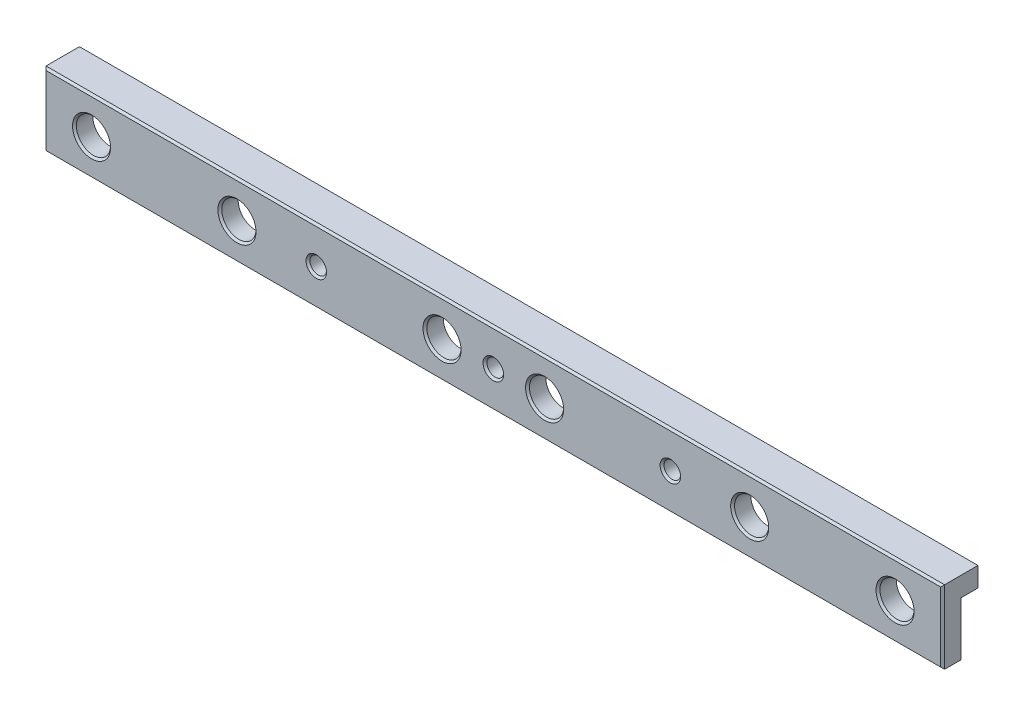
ISO-10303-21;
HEADER;
FILE_DESCRIPTION(('STEP AP214'),'2;1');
FILE_NAME('part.step','',(''),(''),'','','');
FILE_SCHEMA(('AUTOMOTIVE_DESIGN { 1 0 10303 214 1 1 1 1 }'));
ENDSEC;
DATA;
#1=APPLICATION_CONTEXT('core data for automotive mechanical design processes');
#2=APPLICATION_PROTOCOL_DEFINITION('international standard','automotive_design',2000,#1);
#3=PRODUCT_CONTEXT('',#1,'mechanical');
#4=PRODUCT('Part','Part','',(#3));
#5=PRODUCT_RELATED_PRODUCT_CATEGORY('part','',(#4));
#6=PRODUCT_DEFINITION_FORMATION('','',#4);
#7=PRODUCT_DEFINITION_CONTEXT('part definition',#1,'design');
#8=PRODUCT_DEFINITION('design','',#6,#7);
#9=PRODUCT_DEFINITION_SHAPE('','',#8);
#10=(LENGTH_UNIT() NAMED_UNIT(*) SI_UNIT(.MILLI.,.METRE.));
#11=(NAMED_UNIT(*) PLANE_ANGLE_UNIT() SI_UNIT($,.RADIAN.));
#12=(NAMED_UNIT(*) SI_UNIT($,.STERADIAN.) SOLID_ANGLE_UNIT());
#13=UNCERTAINTY_MEASURE_WITH_UNIT(LENGTH_MEASURE(1.E-05),#10,'distance_accuracy_value','');
#14=(GEOMETRIC_REPRESENTATION_CONTEXT(3) GLOBAL_UNCERTAINTY_ASSIGNED_CONTEXT((#13)) GLOBAL_UNIT_ASSIGNED_CONTEXT((#10,
#11,#12)) REPRESENTATION_CONTEXT('',''));
#15=CARTESIAN_POINT('',(0.,0.,0.));
#16=DIRECTION('',(0.,0.,1.));
#17=DIRECTION('',(1.,0.,0.));
#18=AXIS2_PLACEMENT_3D('',#15,#16,#17);
#19=CARTESIAN_POINT('',(92.,0.,-7.25));
#20=DIRECTION('',(-1.,0.,0.));
#21=DIRECTION('',(0.,0.,1.));
#22=AXIS2_PLACEMENT_3D('',#19,#20,#21);
#23=PLANE('',#22);
#24=DIRECTION('',(0.,0.,1.));
#25=VECTOR('',#24,1.);
#26=CARTESIAN_POINT('',(92.,7.50000000000001,-7.25));
#27=LINE('',#26,#25);
#28=CARTESIAN_POINT('',(92.,7.50000000000001,-7.25));
#29=VERTEX_POINT('',#28);
#30=CARTESIAN_POINT('',(92.,7.50000000000001,-0.399999999999985));
#31=VERTEX_POINT('',#30);
#32=EDGE_CURVE('E157',#29,#31,#27,.T.);
#33=ORIENTED_EDGE('',*,*,#32,.T.);
#34=DIRECTION('',(0.,-1.,0.));
#35=VECTOR('',#34,1.);
#36=CARTESIAN_POINT('',(92.,-7.49999999999999,-0.399999999999984));
#37=LINE('',#36,#35);
#38=CARTESIAN_POINT('',(92.,-7.49999999999999,-0.399999999999985));
#39=VERTEX_POINT('',#38);
#40=EDGE_CURVE('E229',#31,#39,#37,.T.);
#41=ORIENTED_EDGE('',*,*,#40,.T.);
#42=DIRECTION('',(0.,0.,1.));
#43=VECTOR('',#42,1.);
#44=CARTESIAN_POINT('',(92.,-7.49999999999999,-7.25));
#45=LINE('',#44,#43);
#46=CARTESIAN_POINT('',(92.,-7.49999999999999,-3.75));
#47=VERTEX_POINT('',#46);
#48=EDGE_CURVE('E153',#47,#39,#45,.T.);
#49=ORIENTED_EDGE('',*,*,#48,.F.);
#50=DIRECTION('',(0.,-1.,0.));
#51=VECTOR('',#50,1.);
#52=CARTESIAN_POINT('',(92.,0.,-3.75));
#53=LINE('',#52,#51);
#54=CARTESIAN_POINT('',(92.,3.50000000000001,-3.75));
#55=VERTEX_POINT('',#54);
#56=EDGE_CURVE('E135',#55,#47,#53,.T.);
#57=ORIENTED_EDGE('',*,*,#56,.F.);
#58=DIRECTION('',(0.,0.,-1.));
#59=VECTOR('',#58,1.);
#60=CARTESIAN_POINT('',(92.,3.50000000000001,-3.75));
#61=LINE('',#60,#59);
#62=CARTESIAN_POINT('',(92.,3.50000000000001,-7.25));
#63=VERTEX_POINT('',#62);
#64=EDGE_CURVE('E386',#55,#63,#61,.T.);
#65=ORIENTED_EDGE('',*,*,#64,.T.);
#66=DIRECTION('',(0.,-1.,0.));
#67=VECTOR('',#66,1.);
#68=CARTESIAN_POINT('',(92.,0.,-7.25));
#69=LINE('',#68,#67);
#70=EDGE_CURVE('E389',#29,#63,#69,.T.);
#71=ORIENTED_EDGE('',*,*,#70,.F.);
#72=EDGE_LOOP('',(#33,#41,#49,#57,#65,#71));
#73=FACE_BOUND('',#72,.T.);
#74=ADVANCED_FACE('F39',(#73),#23,.F.);
#75=CARTESIAN_POINT('',(-92.,0.,-7.25));
#76=DIRECTION('',(-1.,0.,0.));
#77=DIRECTION('',(0.,0.,1.));
#78=AXIS2_PLACEMENT_3D('',#75,#76,#77);
#79=PLANE('',#78);
#80=DIRECTION('',(0.,0.,1.));
#81=VECTOR('',#80,1.);
#82=CARTESIAN_POINT('',(-92.,-7.50000000000001,-7.25));
#83=LINE('',#82,#81);
#84=CARTESIAN_POINT('',(-92.,-7.50000000000001,-3.75));
#85=VERTEX_POINT('',#84);
#86=CARTESIAN_POINT('',(-92.,-7.50000000000001,-0.399999999999985));
#87=VERTEX_POINT('',#86);
#88=EDGE_CURVE('E143',#85,#87,#83,.T.);
#89=ORIENTED_EDGE('',*,*,#88,.T.);
#90=DIRECTION('',(0.,1.,0.));
#91=VECTOR('',#90,1.);
#92=CARTESIAN_POINT('',(-92.,0.,-0.399999999999984));
#93=LINE('',#92,#91);
#94=CARTESIAN_POINT('',(-92.,7.49999999999999,-0.399999999999985));
#95=VERTEX_POINT('',#94);
#96=EDGE_CURVE('E65',#87,#95,#93,.T.);
#97=ORIENTED_EDGE('',*,*,#96,.T.);
#98=DIRECTION('',(0.,0.,1.));
#99=VECTOR('',#98,1.);
#100=CARTESIAN_POINT('',(-92.,7.49999999999999,-7.25));
#101=LINE('',#100,#99);
#102=CARTESIAN_POINT('',(-92.,7.49999999999999,-7.25));
#103=VERTEX_POINT('',#102);
#104=EDGE_CURVE('E154',#103,#95,#101,.T.);
#105=ORIENTED_EDGE('',*,*,#104,.F.);
#106=DIRECTION('',(0.,-1.,0.));
#107=VECTOR('',#106,1.);
#108=CARTESIAN_POINT('',(-92.,0.,-7.25));
#109=LINE('',#108,#107);
#110=CARTESIAN_POINT('',(-92.,3.49999999999999,-7.25));
#111=VERTEX_POINT('',#110);
#112=EDGE_CURVE('E162',#103,#111,#109,.T.);
#113=ORIENTED_EDGE('',*,*,#112,.T.);
#114=DIRECTION('',(0.,0.,-1.));
#115=VECTOR('',#114,1.);
#116=CARTESIAN_POINT('',(-92.,3.49999999999999,-3.75));
#117=LINE('',#116,#115);
#118=CARTESIAN_POINT('',(-92.,3.49999999999999,-3.75));
#119=VERTEX_POINT('',#118);
#120=EDGE_CURVE('E146',#119,#111,#117,.T.);
#121=ORIENTED_EDGE('',*,*,#120,.F.);
#122=DIRECTION('',(0.,-1.,0.));
#123=VECTOR('',#122,1.);
#124=CARTESIAN_POINT('',(-92.,0.,-3.75));
#125=LINE('',#124,#123);
#126=EDGE_CURVE('E131',#119,#85,#125,.T.);
#127=ORIENTED_EDGE('',*,*,#126,.T.);
#128=EDGE_LOOP('',(#89,#97,#105,#113,#121,#127));
#129=FACE_BOUND('',#128,.T.);
#130=ADVANCED_FACE('F142',(#129),#79,.T.);
#131=CARTESIAN_POINT('',(0.,0.,-7.25));
#132=DIRECTION('',(0.,0.,1.));
#133=DIRECTION('',(1.,0.,0.));
#134=AXIS2_PLACEMENT_3D('',#131,#132,#133);
#135=PLANE('',#134);
#136=DIRECTION('',(-1.,0.,0.));
#137=VECTOR('',#136,1.);
#138=CARTESIAN_POINT('',(0.,3.5,-7.25));
#139=LINE('',#138,#137);
#140=EDGE_CURVE('E140',#63,#111,#139,.T.);
#141=ORIENTED_EDGE('',*,*,#140,.T.);
#142=ORIENTED_EDGE('',*,*,#112,.F.);
#143=DIRECTION('',(-1.,0.,0.));
#144=VECTOR('',#143,1.);
#145=CARTESIAN_POINT('',(0.,7.5,-7.25));
#146=LINE('',#145,#144);
#147=EDGE_CURVE('E393',#29,#103,#146,.T.);
#148=ORIENTED_EDGE('',*,*,#147,.F.);
#149=ORIENTED_EDGE('',*,*,#70,.T.);
#150=EDGE_LOOP('',(#141,#142,#148,#149));
#151=FACE_BOUND('',#150,.T.);
#152=ADVANCED_FACE('F296',(#151),#135,.F.);
#153=CARTESIAN_POINT('',(0.,-7.5,-7.25));
#154=DIRECTION('',(0.,1.,0.));
#155=DIRECTION('',(-1.,0.,0.));
#156=AXIS2_PLACEMENT_3D('',#153,#154,#155);
#157=PLANE('',#156);
#158=ORIENTED_EDGE('',*,*,#48,.T.);
#159=DIRECTION('',(-1.,0.,0.));
#160=VECTOR('',#159,1.);
#161=CARTESIAN_POINT('',(-92.,-7.50000000000001,-0.399999999999984));
#162=LINE('',#161,#160);
#163=EDGE_CURVE('E152',#39,#87,#162,.T.);
#164=ORIENTED_EDGE('',*,*,#163,.T.);
#165=ORIENTED_EDGE('',*,*,#88,.F.);
#166=DIRECTION('',(-1.,0.,0.));
#167=VECTOR('',#166,1.);
#168=CARTESIAN_POINT('',(0.,-7.5,-3.75));
#169=LINE('',#168,#167);
#170=EDGE_CURVE('E126',#47,#85,#169,.T.);
#171=ORIENTED_EDGE('',*,*,#170,.F.);
#172=EDGE_LOOP('',(#158,#164,#165,#171));
#173=FACE_BOUND('',#172,.T.);
#174=ADVANCED_FACE('F150',(#173),#157,.F.);
#175=CARTESIAN_POINT('',(0.,7.5,-7.25));
#176=DIRECTION('',(0.,1.,0.));
#177=DIRECTION('',(-1.,0.,0.));
#178=AXIS2_PLACEMENT_3D('',#175,#176,#177);
#179=PLANE('',#178);
#180=ORIENTED_EDGE('',*,*,#104,.T.);
#181=DIRECTION('',(1.,0.,0.));
#182=VECTOR('',#181,1.);
#183=CARTESIAN_POINT('',(0.,7.5,-0.399999999999984));
#184=LINE('',#183,#182);
#185=EDGE_CURVE('E57',#95,#31,#184,.T.);
#186=ORIENTED_EDGE('',*,*,#185,.T.);
#187=ORIENTED_EDGE('',*,*,#32,.F.);
#188=ORIENTED_EDGE('',*,*,#147,.T.);
#189=EDGE_LOOP('',(#180,#186,#187,#188));
#190=FACE_BOUND('',#189,.T.);
#191=ADVANCED_FACE('F299',(#190),#179,.T.);
#192=CARTESIAN_POINT('',(0.,0.,0.));
#193=DIRECTION('',(0.,0.,1.));
#194=DIRECTION('',(1.,0.,0.));
#195=AXIS2_PLACEMENT_3D('',#192,#193,#194);
#196=PLANE('',#195);
#197=DIRECTION('',(0.,-1.,0.));
#198=VECTOR('',#197,1.);
#199=CARTESIAN_POINT('',(-91.6,0.,0.));
#200=LINE('',#199,#198);
#201=CARTESIAN_POINT('',(-91.6,7.1,0.));
#202=VERTEX_POINT('',#201);
#203=CARTESIAN_POINT('',(-91.6,-7.10000000000003,0.));
#204=VERTEX_POINT('',#203);
#205=EDGE_CURVE('E222',#202,#204,#200,.T.);
#206=ORIENTED_EDGE('',*,*,#205,.T.);
#207=DIRECTION('',(1.,0.,0.));
#208=VECTOR('',#207,1.);
#209=CARTESIAN_POINT('',(92.,-7.1,0.));
#210=LINE('',#209,#208);
#211=CARTESIAN_POINT('',(91.6,-7.1,0.));
#212=VERTEX_POINT('',#211);
#213=EDGE_CURVE('E224',#204,#212,#210,.T.);
#214=ORIENTED_EDGE('',*,*,#213,.T.);
#215=DIRECTION('',(0.,1.,0.));
#216=VECTOR('',#215,1.);
#217=CARTESIAN_POINT('',(91.6,7.50000000000001,0.));
#218=LINE('',#217,#216);
#219=CARTESIAN_POINT('',(91.6,7.10000000000003,0.));
#220=VERTEX_POINT('',#219);
#221=EDGE_CURVE('E218',#212,#220,#218,.T.);
#222=ORIENTED_EDGE('',*,*,#221,.T.);
#223=DIRECTION('',(-1.,0.,0.));
#224=VECTOR('',#223,1.);
#225=CARTESIAN_POINT('',(0.,7.10000000000002,0.));
#226=LINE('',#225,#224);
#227=EDGE_CURVE('E220',#220,#202,#226,.T.);
#228=ORIENTED_EDGE('',*,*,#227,.T.);
#229=EDGE_LOOP('',(#206,#214,#222,#228));
#230=FACE_BOUND('',#229,.T.);
#231=CARTESIAN_POINT('',(-52.5,0.,0.));
#232=DIRECTION('',(0.,0.,1.));
#233=DIRECTION('',(1.,0.,0.));
#234=AXIS2_PLACEMENT_3D('',#231,#232,#233);
#235=CIRCLE('',#234,3.90000000000004);
#236=CARTESIAN_POINT('',(-48.6,0.,0.));
#237=VERTEX_POINT('',#236);
#238=EDGE_CURVE('E215',#237,#237,#235,.F.);
#239=ORIENTED_EDGE('',*,*,#238,.T.);
#240=EDGE_LOOP('',(#239));
#241=FACE_BOUND('',#240,.T.);
#242=CARTESIAN_POINT('',(36.25,0.,0.));
#243=DIRECTION('',(0.,0.,1.));
#244=DIRECTION('',(1.,0.,0.));
#245=AXIS2_PLACEMENT_3D('',#242,#243,#244);
#246=CIRCLE('',#245,2.10000000000007);
#247=CARTESIAN_POINT('',(38.3500000000001,0.,0.));
#248=VERTEX_POINT('',#247);
#249=EDGE_CURVE('E212',#248,#248,#246,.F.);
#250=ORIENTED_EDGE('',*,*,#249,.T.);
#251=EDGE_LOOP('',(#250));
#252=FACE_BOUND('',#251,.T.);
#253=CARTESIAN_POINT('',(52.5,0.,0.));
#254=DIRECTION('',(0.,0.,1.));
#255=DIRECTION('',(1.,0.,0.));
#256=AXIS2_PLACEMENT_3D('',#253,#254,#255);
#257=CIRCLE('',#256,3.90000000000007);
#258=CARTESIAN_POINT('',(56.4000000000001,0.,0.));
#259=VERTEX_POINT('',#258);
#260=EDGE_CURVE('E209',#259,#259,#257,.F.);
#261=ORIENTED_EDGE('',*,*,#260,.T.);
#262=EDGE_LOOP('',(#261));
#263=FACE_BOUND('',#262,.T.);
#264=CARTESIAN_POINT('',(-82.27,0.,0.));
#265=DIRECTION('',(0.,0.,1.));
#266=DIRECTION('',(1.,0.,0.));
#267=AXIS2_PLACEMENT_3D('',#264,#265,#266);
#268=CIRCLE('',#267,3.90000000000004);
#269=CARTESIAN_POINT('',(-78.37,0.,0.));
#270=VERTEX_POINT('',#269);
#271=EDGE_CURVE('E206',#270,#270,#268,.F.);
#272=ORIENTED_EDGE('',*,*,#271,.T.);
#273=EDGE_LOOP('',(#272));
#274=FACE_BOUND('',#273,.T.);
#275=CARTESIAN_POINT('',(82.27,0.,0.));
#276=DIRECTION('',(0.,0.,1.));
#277=DIRECTION('',(1.,0.,0.));
#278=AXIS2_PLACEMENT_3D('',#275,#276,#277);
#279=CIRCLE('',#278,3.90000000000004);
#280=CARTESIAN_POINT('',(86.1700000000001,0.,0.));
#281=VERTEX_POINT('',#280);
#282=EDGE_CURVE('E203',#281,#281,#279,.F.);
#283=ORIENTED_EDGE('',*,*,#282,.T.);
#284=EDGE_LOOP('',(#283));
#285=FACE_BOUND('',#284,.T.);
#286=CARTESIAN_POINT('',(10.5,0.,0.));
#287=DIRECTION('',(0.,0.,1.));
#288=DIRECTION('',(1.,0.,0.));
#289=AXIS2_PLACEMENT_3D('',#286,#287,#288);
#290=CIRCLE('',#289,3.90000000000007);
#291=CARTESIAN_POINT('',(14.4000000000001,0.,0.));
#292=VERTEX_POINT('',#291);
#293=EDGE_CURVE('E200',#292,#292,#290,.F.);
#294=ORIENTED_EDGE('',*,*,#293,.T.);
#295=EDGE_LOOP('',(#294));
#296=FACE_BOUND('',#295,.T.);
#297=CARTESIAN_POINT('',(0.,0.,0.));
#298=DIRECTION('',(0.,0.,1.));
#299=DIRECTION('',(1.,0.,0.));
#300=AXIS2_PLACEMENT_3D('',#297,#298,#299);
#301=CIRCLE('',#300,2.10000000000005);
#302=CARTESIAN_POINT('',(2.10000000000005,0.,0.));
#303=VERTEX_POINT('',#302);
#304=EDGE_CURVE('E197',#303,#303,#301,.F.);
#305=ORIENTED_EDGE('',*,*,#304,.T.);
#306=EDGE_LOOP('',(#305));
#307=FACE_BOUND('',#306,.T.);
#308=CARTESIAN_POINT('',(-10.5,0.,0.));
#309=DIRECTION('',(0.,0.,1.));
#310=DIRECTION('',(1.,0.,0.));
#311=AXIS2_PLACEMENT_3D('',#308,#309,#310);
#312=CIRCLE('',#311,3.90000000000007);
#313=CARTESIAN_POINT('',(-6.59999999999995,0.,0.));
#314=VERTEX_POINT('',#313);
#315=EDGE_CURVE('E194',#314,#314,#312,.F.);
#316=ORIENTED_EDGE('',*,*,#315,.T.);
#317=EDGE_LOOP('',(#316));
#318=FACE_BOUND('',#317,.T.);
#319=CARTESIAN_POINT('',(-36.25,0.,0.));
#320=DIRECTION('',(0.,0.,1.));
#321=DIRECTION('',(1.,0.,0.));
#322=AXIS2_PLACEMENT_3D('',#319,#320,#321);
#323=CIRCLE('',#322,2.10000000000007);
#324=CARTESIAN_POINT('',(-34.15,0.,0.));
#325=VERTEX_POINT('',#324);
#326=EDGE_CURVE('E191',#325,#325,#323,.F.);
#327=ORIENTED_EDGE('',*,*,#326,.T.);
#328=EDGE_LOOP('',(#327));
#329=FACE_BOUND('',#328,.T.);
#330=ADVANCED_FACE('F273',(#230,#241,#252,#263,#274,#285,#296,#307,#318,#329),#196,.T.);
#331=CARTESIAN_POINT('',(0.,3.5,-3.75));
#332=DIRECTION('',(0.,-1.,0.));
#333=DIRECTION('',(1.,0.,0.));
#334=AXIS2_PLACEMENT_3D('',#331,#332,#333);
#335=PLANE('',#334);
#336=DIRECTION('',(-1.,0.,0.));
#337=VECTOR('',#336,1.);
#338=CARTESIAN_POINT('',(0.,3.5,-3.75));
#339=LINE('',#338,#337);
#340=CARTESIAN_POINT('',(82.27,3.50000000000001,-3.75));
#341=VERTEX_POINT('',#340);
#342=EDGE_CURVE('E382',#55,#341,#339,.T.);
#343=ORIENTED_EDGE('',*,*,#342,.T.);
#344=CARTESIAN_POINT('',(52.5,3.50000000000001,-3.75));
#345=VERTEX_POINT('',#344);
#346=EDGE_CURVE('E381',#341,#345,#339,.T.);
#347=ORIENTED_EDGE('',*,*,#346,.T.);
#348=CARTESIAN_POINT('',(10.5,3.5,-3.75));
#349=VERTEX_POINT('',#348);
#350=EDGE_CURVE('E380',#345,#349,#339,.T.);
#351=ORIENTED_EDGE('',*,*,#350,.T.);
#352=CARTESIAN_POINT('',(-10.5,3.5,-3.75));
#353=VERTEX_POINT('',#352);
#354=EDGE_CURVE('E367',#349,#353,#339,.T.);
#355=ORIENTED_EDGE('',*,*,#354,.T.);
#356=CARTESIAN_POINT('',(-52.5,3.49999999999999,-3.75));
#357=VERTEX_POINT('',#356);
#358=EDGE_CURVE('E370',#353,#357,#339,.T.);
#359=ORIENTED_EDGE('',*,*,#358,.T.);
#360=CARTESIAN_POINT('',(-82.27,3.49999999999999,-3.75));
#361=VERTEX_POINT('',#360);
#362=EDGE_CURVE('E374',#357,#361,#339,.T.);
#363=ORIENTED_EDGE('',*,*,#362,.T.);
#364=EDGE_CURVE('E147',#361,#119,#339,.T.);
#365=ORIENTED_EDGE('',*,*,#364,.T.);
#366=ORIENTED_EDGE('',*,*,#120,.T.);
#367=ORIENTED_EDGE('',*,*,#140,.F.);
#368=ORIENTED_EDGE('',*,*,#64,.F.);
#369=EDGE_LOOP('',(#343,#347,#351,#355,#359,#363,#365,#366,#367,#368));
#370=FACE_BOUND('',#369,.T.);
#371=ADVANCED_FACE('F377',(#370),#335,.T.);
#372=CARTESIAN_POINT('',(0.,0.,-3.75));
#373=DIRECTION('',(0.,0.,1.));
#374=DIRECTION('',(1.,0.,0.));
#375=AXIS2_PLACEMENT_3D('',#372,#373,#374);
#376=PLANE('',#375);
#377=CARTESIAN_POINT('',(-36.25,0.,-3.75));
#378=DIRECTION('',(0.,0.,1.));
#379=DIRECTION('',(1.,0.,0.));
#380=AXIS2_PLACEMENT_3D('',#377,#378,#379);
#381=CIRCLE('',#380,1.7);
#382=CARTESIAN_POINT('',(-34.55,0.,-3.75));
#383=VERTEX_POINT('',#382);
#384=EDGE_CURVE('E187',#383,#383,#381,.T.);
#385=ORIENTED_EDGE('',*,*,#384,.T.);
#386=EDGE_LOOP('',(#385));
#387=FACE_BOUND('',#386,.T.);
#388=CARTESIAN_POINT('',(0.,0.,-3.75));
#389=DIRECTION('',(0.,0.,1.));
#390=DIRECTION('',(1.,0.,0.));
#391=AXIS2_PLACEMENT_3D('',#388,#389,#390);
#392=CIRCLE('',#391,1.7);
#393=CARTESIAN_POINT('',(1.7,0.,-3.75));
#394=VERTEX_POINT('',#393);
#395=EDGE_CURVE('E181',#394,#394,#392,.T.);
#396=ORIENTED_EDGE('',*,*,#395,.T.);
#397=EDGE_LOOP('',(#396));
#398=FACE_BOUND('',#397,.T.);
#399=CARTESIAN_POINT('',(36.25,0.,-3.75));
#400=DIRECTION('',(0.,0.,1.));
#401=DIRECTION('',(1.,0.,0.));
#402=AXIS2_PLACEMENT_3D('',#399,#400,#401);
#403=CIRCLE('',#402,1.7);
#404=CARTESIAN_POINT('',(37.95,0.,-3.75));
#405=VERTEX_POINT('',#404);
#406=EDGE_CURVE('E166',#405,#405,#403,.T.);
#407=ORIENTED_EDGE('',*,*,#406,.T.);
#408=EDGE_LOOP('',(#407));
#409=FACE_BOUND('',#408,.T.);
#410=ORIENTED_EDGE('',*,*,#358,.F.);
#411=CARTESIAN_POINT('',(-10.5,0.,-3.75));
#412=DIRECTION('',(0.,0.,1.));
#413=DIRECTION('',(1.,0.,0.));
#414=AXIS2_PLACEMENT_3D('',#411,#412,#413);
#415=CIRCLE('',#414,3.5);
#416=EDGE_CURVE('E184',#353,#353,#415,.T.);
#417=ORIENTED_EDGE('',*,*,#416,.T.);
#418=ORIENTED_EDGE('',*,*,#354,.F.);
#419=CARTESIAN_POINT('',(10.5,0.,-3.75));
#420=DIRECTION('',(0.,0.,1.));
#421=DIRECTION('',(1.,0.,0.));
#422=AXIS2_PLACEMENT_3D('',#419,#420,#421);
#423=CIRCLE('',#422,3.5);
#424=EDGE_CURVE('E178',#349,#349,#423,.T.);
#425=ORIENTED_EDGE('',*,*,#424,.T.);
#426=ORIENTED_EDGE('',*,*,#350,.F.);
#427=CARTESIAN_POINT('',(52.5,0.,-3.75));
#428=DIRECTION('',(0.,0.,1.));
#429=DIRECTION('',(1.,0.,0.));
#430=AXIS2_PLACEMENT_3D('',#427,#428,#429);
#431=CIRCLE('',#430,3.5);
#432=EDGE_CURVE('E169',#345,#345,#431,.T.);
#433=ORIENTED_EDGE('',*,*,#432,.T.);
#434=ORIENTED_EDGE('',*,*,#346,.F.);
#435=CARTESIAN_POINT('',(82.27,0.,-3.75));
#436=DIRECTION('',(0.,0.,1.));
#437=DIRECTION('',(1.,0.,0.));
#438=AXIS2_PLACEMENT_3D('',#435,#436,#437);
#439=CIRCLE('',#438,3.50000000000001);
#440=EDGE_CURVE('E175',#341,#341,#439,.T.);
#441=ORIENTED_EDGE('',*,*,#440,.T.);
#442=ORIENTED_EDGE('',*,*,#342,.F.);
#443=ORIENTED_EDGE('',*,*,#56,.T.);
#444=ORIENTED_EDGE('',*,*,#170,.T.);
#445=ORIENTED_EDGE('',*,*,#126,.F.);
#446=ORIENTED_EDGE('',*,*,#364,.F.);
#447=CARTESIAN_POINT('',(-82.27,0.,-3.75));
#448=DIRECTION('',(0.,0.,1.));
#449=DIRECTION('',(1.,0.,0.));
#450=AXIS2_PLACEMENT_3D('',#447,#448,#449);
#451=CIRCLE('',#450,3.50000000000001);
#452=EDGE_CURVE('E172',#361,#361,#451,.T.);
#453=ORIENTED_EDGE('',*,*,#452,.T.);
#454=ORIENTED_EDGE('',*,*,#362,.F.);
#455=CARTESIAN_POINT('',(-52.5,0.,-3.75));
#456=DIRECTION('',(0.,0.,1.));
#457=DIRECTION('',(1.,0.,0.));
#458=AXIS2_PLACEMENT_3D('',#455,#456,#457);
#459=CIRCLE('',#458,3.5);
#460=EDGE_CURVE('E163',#357,#357,#459,.T.);
#461=ORIENTED_EDGE('',*,*,#460,.T.);
#462=EDGE_LOOP('',(#410,#417,#418,#425,#426,#433,#434,#441,#442,#443,#444,#445,#446,#453,#454,#461));
#463=FACE_BOUND('',#462,.T.);
#464=ADVANCED_FACE('F129',(#387,#398,#409,#463),#376,.F.);
#465=CARTESIAN_POINT('',(-52.5,0.,-7.25));
#466=DIRECTION('',(0.,0.,1.));
#467=DIRECTION('',(1.,0.,0.));
#468=AXIS2_PLACEMENT_3D('',#465,#466,#467);
#469=CYLINDRICAL_SURFACE('',#468,3.5);
#470=CARTESIAN_POINT('',(-52.5,0.,-0.400000000000026));
#471=DIRECTION('',(0.,0.,1.));
#472=DIRECTION('',(1.,0.,0.));
#473=AXIS2_PLACEMENT_3D('',#470,#471,#472);
#474=CIRCLE('',#473,3.5);
#475=CARTESIAN_POINT('',(-49.,0.,-0.400000000000026));
#476=VERTEX_POINT('',#475);
#477=EDGE_CURVE('E231',#476,#476,#474,.T.);
#478=ORIENTED_EDGE('',*,*,#477,.T.);
#479=EDGE_LOOP('',(#478));
#480=FACE_BOUND('',#479,.T.);
#481=ORIENTED_EDGE('',*,*,#460,.F.);
#482=EDGE_LOOP('',(#481));
#483=FACE_BOUND('',#482,.T.);
#484=ADVANCED_FACE('F420',(#480,#483),#469,.F.);
#485=CARTESIAN_POINT('',(36.25,0.,-7.25));
#486=DIRECTION('',(0.,0.,1.));
#487=DIRECTION('',(1.,0.,0.));
#488=AXIS2_PLACEMENT_3D('',#485,#486,#487);
#489=CYLINDRICAL_SURFACE('',#488,1.7);
#490=CARTESIAN_POINT('',(36.25,0.,-0.40000000000008));
#491=DIRECTION('',(0.,0.,1.));
#492=DIRECTION('',(1.,0.,0.));
#493=AXIS2_PLACEMENT_3D('',#490,#491,#492);
#494=CIRCLE('',#493,1.7);
#495=CARTESIAN_POINT('',(37.95,0.,-0.400000000000081));
#496=VERTEX_POINT('',#495);
#497=EDGE_CURVE('E234',#496,#496,#494,.T.);
#498=CARTESIAN_POINT('',(37.95,0.,-0.400000000000081));
#499=CARTESIAN_POINT('',(37.95,0.,-0.434895833333413));
#500=CARTESIAN_POINT('',(37.95,0.,-0.469791666666746));
#501=CARTESIAN_POINT('',(37.95,0.,-0.539583333333411));
#502=CARTESIAN_POINT('',(37.95,0.,-0.574479166666743));
#503=CARTESIAN_POINT('',(37.95,0.,-0.644270833333408));
#504=CARTESIAN_POINT('',(37.95,0.,-0.679166666666741));
#505=CARTESIAN_POINT('',(37.95,0.,-0.748958333333406));
#506=CARTESIAN_POINT('',(37.95,0.,-0.783854166666739));
#507=CARTESIAN_POINT('',(37.95,0.,-0.853645833333404));
#508=CARTESIAN_POINT('',(37.95,0.,-0.888541666666736));
#509=CARTESIAN_POINT('',(37.95,0.,-0.958333333333401));
#510=CARTESIAN_POINT('',(37.95,0.,-0.993229166666733));
#511=CARTESIAN_POINT('',(37.95,0.,-1.0630208333334));
#512=CARTESIAN_POINT('',(37.95,0.,-1.09791666666673));
#513=CARTESIAN_POINT('',(37.95,0.,-1.1677083333334));
#514=CARTESIAN_POINT('',(37.95,0.,-1.20260416666673));
#515=CARTESIAN_POINT('',(37.95,0.,-1.27239583333339));
#516=CARTESIAN_POINT('',(37.95,0.,-1.30729166666673));
#517=CARTESIAN_POINT('',(37.95,0.,-1.37708333333339));
#518=CARTESIAN_POINT('',(37.95,0.,-1.41197916666672));
#519=CARTESIAN_POINT('',(37.95,0.,-1.48177083333339));
#520=CARTESIAN_POINT('',(37.95,0.,-1.51666666666672));
#521=CARTESIAN_POINT('',(37.95,0.,-1.58645833333339));
#522=CARTESIAN_POINT('',(37.95,0.,-1.62135416666672));
#523=CARTESIAN_POINT('',(37.95,0.,-1.69114583333338));
#524=CARTESIAN_POINT('',(37.95,0.,-1.72604166666672));
#525=CARTESIAN_POINT('',(37.95,0.,-1.79583333333338));
#526=CARTESIAN_POINT('',(37.95,0.,-1.83072916666671));
#527=CARTESIAN_POINT('',(37.95,0.,-1.90052083333338));
#528=CARTESIAN_POINT('',(37.95,0.,-1.93541666666671));
#529=CARTESIAN_POINT('',(37.95,0.,-2.00520833333338));
#530=CARTESIAN_POINT('',(37.95,0.,-2.04010416666671));
#531=CARTESIAN_POINT('',(37.95,0.,-2.10989583333337));
#532=CARTESIAN_POINT('',(37.95,0.,-2.14479166666671));
#533=CARTESIAN_POINT('',(37.95,0.,-2.21458333333337));
#534=CARTESIAN_POINT('',(37.95,0.,-2.2494791666667));
#535=CARTESIAN_POINT('',(37.95,0.,-2.31927083333337));
#536=CARTESIAN_POINT('',(37.95,0.,-2.3541666666667));
#537=CARTESIAN_POINT('',(37.95,0.,-2.42395833333337));
#538=CARTESIAN_POINT('',(37.95,0.,-2.4588541666667));
#539=CARTESIAN_POINT('',(37.95,0.,-2.52864583333336));
#540=CARTESIAN_POINT('',(37.95,0.,-2.5635416666667));
#541=CARTESIAN_POINT('',(37.95,0.,-2.63333333333336));
#542=CARTESIAN_POINT('',(37.95,0.,-2.66822916666669));
#543=CARTESIAN_POINT('',(37.95,0.,-2.73802083333336));
#544=CARTESIAN_POINT('',(37.95,0.,-2.77291666666669));
#545=CARTESIAN_POINT('',(37.95,0.,-2.84270833333336));
#546=CARTESIAN_POINT('',(37.95,0.,-2.87760416666669));
#547=CARTESIAN_POINT('',(37.95,0.,-2.94739583333335));
#548=CARTESIAN_POINT('',(37.95,0.,-2.98229166666669));
#549=CARTESIAN_POINT('',(37.95,0.,-3.05208333333335));
#550=CARTESIAN_POINT('',(37.95,0.,-3.08697916666668));
#551=CARTESIAN_POINT('',(37.95,0.,-3.15677083333335));
#552=CARTESIAN_POINT('',(37.95,0.,-3.19166666666668));
#553=CARTESIAN_POINT('',(37.95,0.,-3.26145833333335));
#554=CARTESIAN_POINT('',(37.95,0.,-3.29635416666668));
#555=CARTESIAN_POINT('',(37.95,0.,-3.36614583333334));
#556=CARTESIAN_POINT('',(37.95,0.,-3.40104166666668));
#557=CARTESIAN_POINT('',(37.95,0.,-3.47083333333334));
#558=CARTESIAN_POINT('',(37.95,0.,-3.50572916666667));
#559=CARTESIAN_POINT('',(37.95,0.,-3.57552083333334));
#560=CARTESIAN_POINT('',(37.95,0.,-3.61041666666667));
#561=CARTESIAN_POINT('',(37.95,0.,-3.68020833333334));
#562=CARTESIAN_POINT('',(37.95,0.,-3.71510416666667));
#563=CARTESIAN_POINT('',(37.95,0.,-3.75));
#564=B_SPLINE_CURVE_WITH_KNOTS('',3,(#498,#499,#500,#501,#502,#503,#504,#505,#506,#507,#508,
#509,#510,#511,#512,#513,#514,#515,#516,#517,#518,#519,#520,#521,#522,#523,#524,#525,#526,#527,
#528,#529,#530,#531,#532,#533,#534,#535,#536,#537,#538,#539,#540,#541,#542,#543,#544,#545,#546,
#547,#548,#549,#550,#551,#552,#553,#554,#555,#556,#557,#558,#559,#560,#561,#562,#563),
.UNSPECIFIED.,.F.,.F.,(4,2,2,2,2,2,2,2,2,2,2,2,2,2,2,2,2,2,2,2,2,2,2,2,2,2,2,2,2,2,2,2,4),(0.,
0.104687499999997,0.209374999999995,0.314062499999992,0.41874999999999,0.523437499999987,
0.628124999999985,0.732812499999983,0.83749999999998,0.942187499999978,1.04687499999997,
1.15156249999997,1.25624999999997,1.36093749999997,1.46562499999997,1.57031249999996,
1.67499999999996,1.77968749999996,1.88437499999995,1.98906249999995,2.09374999999995,
2.19843749999995,2.30312499999995,2.40781249999994,2.51249999999994,2.61718749999994,
2.72187499999993,2.82656249999993,2.93124999999993,3.03593749999993,3.14062499999992,
3.24531249999992,3.34999999999992),.UNSPECIFIED.);
#565=EDGE_CURVE('BSEAM417',#496,#405,#564,.T.);
#566=ORIENTED_EDGE('',*,*,#497,.T.);
#567=ORIENTED_EDGE('',*,*,#406,.F.);
#568=ORIENTED_EDGE('',*,*,#565,.T.);
#569=ORIENTED_EDGE('',*,*,#565,.F.);
#570=EDGE_LOOP('',(#566,#568,#567,#569));
#571=FACE_BOUND('',#570,.T.);
#572=ADVANCED_FACE('F417',(#571),#489,.F.);
#573=CARTESIAN_POINT('',(52.5,0.,-7.25));
#574=DIRECTION('',(0.,0.,1.));
#575=DIRECTION('',(1.,0.,0.));
#576=AXIS2_PLACEMENT_3D('',#573,#574,#575);
#577=CYLINDRICAL_SURFACE('',#576,3.5);
#578=CARTESIAN_POINT('',(52.5,0.,-0.400000000000082));
#579=DIRECTION('',(0.,0.,1.));
#580=DIRECTION('',(1.,0.,0.));
#581=AXIS2_PLACEMENT_3D('',#578,#579,#580);
#582=CIRCLE('',#581,3.5);
#583=CARTESIAN_POINT('',(56.,0.,-0.400000000000082));
#584=VERTEX_POINT('',#583);
#585=EDGE_CURVE('E237',#584,#584,#582,.T.);
#586=ORIENTED_EDGE('',*,*,#585,.T.);
#587=EDGE_LOOP('',(#586));
#588=FACE_BOUND('',#587,.T.);
#589=ORIENTED_EDGE('',*,*,#432,.F.);
#590=EDGE_LOOP('',(#589));
#591=FACE_BOUND('',#590,.T.);
#592=ADVANCED_FACE('F413',(#588,#591),#577,.F.);
#593=CARTESIAN_POINT('',(-82.27,0.,-7.25));
#594=DIRECTION('',(0.,0.,1.));
#595=DIRECTION('',(1.,0.,0.));
#596=AXIS2_PLACEMENT_3D('',#593,#594,#595);
#597=CYLINDRICAL_SURFACE('',#596,3.50000000000001);
#598=CARTESIAN_POINT('',(-82.27,0.,-0.400000000000019));
#599=DIRECTION('',(0.,0.,1.));
#600=DIRECTION('',(1.,0.,0.));
#601=AXIS2_PLACEMENT_3D('',#598,#599,#600);
#602=CIRCLE('',#601,3.50000000000001);
#603=CARTESIAN_POINT('',(-78.77,0.,-0.400000000000019));
#604=VERTEX_POINT('',#603);
#605=EDGE_CURVE('E240',#604,#604,#602,.T.);
#606=ORIENTED_EDGE('',*,*,#605,.T.);
#607=EDGE_LOOP('',(#606));
#608=FACE_BOUND('',#607,.T.);
#609=ORIENTED_EDGE('',*,*,#452,.F.);
#610=EDGE_LOOP('',(#609));
#611=FACE_BOUND('',#610,.T.);
#612=ADVANCED_FACE('F404',(#608,#611),#597,.F.);
#613=CARTESIAN_POINT('',(82.27,0.,-7.25));
#614=DIRECTION('',(0.,0.,1.));
#615=DIRECTION('',(1.,0.,0.));
#616=AXIS2_PLACEMENT_3D('',#613,#614,#615);
#617=CYLINDRICAL_SURFACE('',#616,3.50000000000001);
#618=CARTESIAN_POINT('',(82.27,0.,-0.400000000000019));
#619=DIRECTION('',(0.,0.,1.));
#620=DIRECTION('',(1.,0.,0.));
#621=AXIS2_PLACEMENT_3D('',#618,#619,#620);
#622=CIRCLE('',#621,3.50000000000001);
#623=CARTESIAN_POINT('',(85.77,0.,-0.400000000000019));
#624=VERTEX_POINT('',#623);
#625=EDGE_CURVE('E243',#624,#624,#622,.T.);
#626=ORIENTED_EDGE('',*,*,#625,.T.);
#627=EDGE_LOOP('',(#626));
#628=FACE_BOUND('',#627,.T.);
#629=ORIENTED_EDGE('',*,*,#440,.F.);
#630=EDGE_LOOP('',(#629));
#631=FACE_BOUND('',#630,.T.);
#632=ADVANCED_FACE('F401',(#628,#631),#617,.F.);
#633=CARTESIAN_POINT('',(10.5,0.,-7.25));
#634=DIRECTION('',(0.,0.,1.));
#635=DIRECTION('',(1.,0.,0.));
#636=AXIS2_PLACEMENT_3D('',#633,#634,#635);
#637=CYLINDRICAL_SURFACE('',#636,3.5);
#638=CARTESIAN_POINT('',(10.5,0.,-0.400000000000082));
#639=DIRECTION('',(0.,0.,1.));
#640=DIRECTION('',(1.,0.,0.));
#641=AXIS2_PLACEMENT_3D('',#638,#639,#640);
#642=CIRCLE('',#641,3.5);
#643=CARTESIAN_POINT('',(14.,0.,-0.400000000000082));
#644=VERTEX_POINT('',#643);
#645=EDGE_CURVE('E246',#644,#644,#642,.T.);
#646=ORIENTED_EDGE('',*,*,#645,.T.);
#647=EDGE_LOOP('',(#646));
#648=FACE_BOUND('',#647,.T.);
#649=ORIENTED_EDGE('',*,*,#424,.F.);
#650=EDGE_LOOP('',(#649));
#651=FACE_BOUND('',#650,.T.);
#652=ADVANCED_FACE('F403',(#648,#651),#637,.F.);
#653=CARTESIAN_POINT('',(0.,0.,-7.25));
#654=DIRECTION('',(0.,0.,1.));
#655=DIRECTION('',(1.,0.,0.));
#656=AXIS2_PLACEMENT_3D('',#653,#654,#655);
#657=CYLINDRICAL_SURFACE('',#656,1.7);
#658=CARTESIAN_POINT('',(0.,0.,-0.400000000000052));
#659=DIRECTION('',(0.,0.,1.));
#660=DIRECTION('',(1.,0.,0.));
#661=AXIS2_PLACEMENT_3D('',#658,#659,#660);
#662=CIRCLE('',#661,1.7);
#663=CARTESIAN_POINT('',(1.7,0.,-0.400000000000053));
#664=VERTEX_POINT('',#663);
#665=EDGE_CURVE('E249',#664,#664,#662,.T.);
#666=CARTESIAN_POINT('',(1.7,0.,-0.400000000000053));
#667=CARTESIAN_POINT('',(1.7,0.,-0.434895833333386));
#668=CARTESIAN_POINT('',(1.7,0.,-0.469791666666718));
#669=CARTESIAN_POINT('',(1.7,0.,-0.539583333333384));
#670=CARTESIAN_POINT('',(1.7,0.,-0.574479166666717));
#671=CARTESIAN_POINT('',(1.7,0.,-0.644270833333383));
#672=CARTESIAN_POINT('',(1.7,0.,-0.679166666666715));
#673=CARTESIAN_POINT('',(1.7,0.,-0.748958333333381));
#674=CARTESIAN_POINT('',(1.7,0.,-0.783854166666714));
#675=CARTESIAN_POINT('',(1.7,0.,-0.85364583333338));
#676=CARTESIAN_POINT('',(1.7,0.,-0.888541666666712));
#677=CARTESIAN_POINT('',(1.7,0.,-0.958333333333378));
#678=CARTESIAN_POINT('',(1.7,0.,-0.99322916666671));
#679=CARTESIAN_POINT('',(1.7,0.,-1.06302083333338));
#680=CARTESIAN_POINT('',(1.7,0.,-1.09791666666671));
#681=CARTESIAN_POINT('',(1.7,0.,-1.16770833333337));
#682=CARTESIAN_POINT('',(1.7,0.,-1.20260416666671));
#683=CARTESIAN_POINT('',(1.7,0.,-1.27239583333337));
#684=CARTESIAN_POINT('',(1.7,0.,-1.30729166666671));
#685=CARTESIAN_POINT('',(1.7,0.,-1.37708333333337));
#686=CARTESIAN_POINT('',(1.7,0.,-1.4119791666667));
#687=CARTESIAN_POINT('',(1.7,0.,-1.48177083333337));
#688=CARTESIAN_POINT('',(1.7,0.,-1.5166666666667));
#689=CARTESIAN_POINT('',(1.7,0.,-1.58645833333337));
#690=CARTESIAN_POINT('',(1.7,0.,-1.6213541666667));
#691=CARTESIAN_POINT('',(1.7,0.,-1.69114583333337));
#692=CARTESIAN_POINT('',(1.7,0.,-1.7260416666667));
#693=CARTESIAN_POINT('',(1.7,0.,-1.79583333333336));
#694=CARTESIAN_POINT('',(1.7,0.,-1.8307291666667));
#695=CARTESIAN_POINT('',(1.7,0.,-1.90052083333336));
#696=CARTESIAN_POINT('',(1.7,0.,-1.9354166666667));
#697=CARTESIAN_POINT('',(1.7,0.,-2.00520833333336));
#698=CARTESIAN_POINT('',(1.7,0.,-2.04010416666669));
#699=CARTESIAN_POINT('',(1.7,0.,-2.10989583333336));
#700=CARTESIAN_POINT('',(1.7,0.,-2.14479166666669));
#701=CARTESIAN_POINT('',(1.7,0.,-2.21458333333336));
#702=CARTESIAN_POINT('',(1.7,0.,-2.24947916666669));
#703=CARTESIAN_POINT('',(1.7,0.,-2.31927083333336));
#704=CARTESIAN_POINT('',(1.7,0.,-2.35416666666669));
#705=CARTESIAN_POINT('',(1.7,0.,-2.42395833333335));
#706=CARTESIAN_POINT('',(1.7,0.,-2.45885416666669));
#707=CARTESIAN_POINT('',(1.7,0.,-2.52864583333335));
#708=CARTESIAN_POINT('',(1.7,0.,-2.56354166666669));
#709=CARTESIAN_POINT('',(1.7,0.,-2.63333333333335));
#710=CARTESIAN_POINT('',(1.7,0.,-2.66822916666668));
#711=CARTESIAN_POINT('',(1.7,0.,-2.73802083333335));
#712=CARTESIAN_POINT('',(1.7,0.,-2.77291666666668));
#713=CARTESIAN_POINT('',(1.7,0.,-2.84270833333335));
#714=CARTESIAN_POINT('',(1.7,0.,-2.87760416666668));
#715=CARTESIAN_POINT('',(1.7,0.,-2.94739583333335));
#716=CARTESIAN_POINT('',(1.7,0.,-2.98229166666668));
#717=CARTESIAN_POINT('',(1.7,0.,-3.05208333333334));
#718=CARTESIAN_POINT('',(1.7,0.,-3.08697916666668));
#719=CARTESIAN_POINT('',(1.7,0.,-3.15677083333334));
#720=CARTESIAN_POINT('',(1.7,0.,-3.19166666666668));
#721=CARTESIAN_POINT('',(1.7,0.,-3.26145833333334));
#722=CARTESIAN_POINT('',(1.7,0.,-3.29635416666667));
#723=CARTESIAN_POINT('',(1.7,0.,-3.36614583333334));
#724=CARTESIAN_POINT('',(1.7,0.,-3.40104166666667));
#725=CARTESIAN_POINT('',(1.7,0.,-3.47083333333334));
#726=CARTESIAN_POINT('',(1.7,0.,-3.50572916666667));
#727=CARTESIAN_POINT('',(1.7,0.,-3.57552083333334));
#728=CARTESIAN_POINT('',(1.7,0.,-3.61041666666667));
#729=CARTESIAN_POINT('',(1.7,0.,-3.68020833333333));
#730=CARTESIAN_POINT('',(1.7,0.,-3.71510416666667));
#731=CARTESIAN_POINT('',(1.7,0.,-3.75));
#732=B_SPLINE_CURVE_WITH_KNOTS('',3,(#666,#667,#668,#669,#670,#671,#672,#673,#674,#675,#676,
#677,#678,#679,#680,#681,#682,#683,#684,#685,#686,#687,#688,#689,#690,#691,#692,#693,#694,#695,
#696,#697,#698,#699,#700,#701,#702,#703,#704,#705,#706,#707,#708,#709,#710,#711,#712,#713,#714,
#715,#716,#717,#718,#719,#720,#721,#722,#723,#724,#725,#726,#727,#728,#729,#730,#731),
.UNSPECIFIED.,.F.,.F.,(4,2,2,2,2,2,2,2,2,2,2,2,2,2,2,2,2,2,2,2,2,2,2,2,2,2,2,2,2,2,2,2,4),(0.,
0.104687499999998,0.209374999999997,0.314062499999995,0.418749999999994,0.523437499999992,
0.62812499999999,0.732812499999989,0.837499999999987,0.942187499999986,1.04687499999998,
1.15156249999998,1.25624999999998,1.36093749999998,1.46562499999998,1.57031249999998,
1.67499999999997,1.77968749999997,1.88437499999997,1.98906249999997,2.09374999999997,
2.19843749999997,2.30312499999996,2.40781249999996,2.51249999999996,2.61718749999996,
2.72187499999996,2.82656249999996,2.93124999999995,3.03593749999995,3.14062499999995,
3.24531249999995,3.34999999999995),.UNSPECIFIED.);
#733=EDGE_CURVE('BSEAM363',#664,#394,#732,.T.);
#734=ORIENTED_EDGE('',*,*,#665,.T.);
#735=ORIENTED_EDGE('',*,*,#395,.F.);
#736=ORIENTED_EDGE('',*,*,#733,.T.);
#737=ORIENTED_EDGE('',*,*,#733,.F.);
#738=EDGE_LOOP('',(#734,#736,#735,#737));
#739=FACE_BOUND('',#738,.T.);
#740=ADVANCED_FACE('F363',(#739),#657,.F.);
#741=CARTESIAN_POINT('',(-10.5,0.,-7.25));
#742=DIRECTION('',(0.,0.,1.));
#743=DIRECTION('',(1.,0.,0.));
#744=AXIS2_PLACEMENT_3D('',#741,#742,#743);
#745=CYLINDRICAL_SURFACE('',#744,3.5);
#746=CARTESIAN_POINT('',(-10.5,0.,-0.400000000000082));
#747=DIRECTION('',(0.,0.,1.));
#748=DIRECTION('',(1.,0.,0.));
#749=AXIS2_PLACEMENT_3D('',#746,#747,#748);
#750=CIRCLE('',#749,3.5);
#751=CARTESIAN_POINT('',(-7.00000000000002,0.,-0.400000000000082));
#752=VERTEX_POINT('',#751);
#753=EDGE_CURVE('E49',#752,#752,#750,.T.);
#754=ORIENTED_EDGE('',*,*,#753,.T.);
#755=EDGE_LOOP('',(#754));
#756=FACE_BOUND('',#755,.T.);
#757=ORIENTED_EDGE('',*,*,#416,.F.);
#758=EDGE_LOOP('',(#757));
#759=FACE_BOUND('',#758,.T.);
#760=ADVANCED_FACE('F359',(#756,#759),#745,.F.);
#761=CARTESIAN_POINT('',(-36.25,0.,-7.25));
#762=DIRECTION('',(0.,0.,1.));
#763=DIRECTION('',(1.,0.,0.));
#764=AXIS2_PLACEMENT_3D('',#761,#762,#763);
#765=CYLINDRICAL_SURFACE('',#764,1.7);
#766=CARTESIAN_POINT('',(-36.25,0.,-0.40000000000008));
#767=DIRECTION('',(0.,0.,1.));
#768=DIRECTION('',(1.,0.,0.));
#769=AXIS2_PLACEMENT_3D('',#766,#767,#768);
#770=CIRCLE('',#769,1.7);
#771=CARTESIAN_POINT('',(-34.55,0.,-0.400000000000081));
#772=VERTEX_POINT('',#771);
#773=EDGE_CURVE('E11',#772,#772,#770,.T.);
#774=CARTESIAN_POINT('',(-34.55,0.,-0.400000000000081));
#775=CARTESIAN_POINT('',(-34.55,0.,-0.434895833333413));
#776=CARTESIAN_POINT('',(-34.55,0.,-0.469791666666746));
#777=CARTESIAN_POINT('',(-34.55,0.,-0.539583333333411));
#778=CARTESIAN_POINT('',(-34.55,0.,-0.574479166666743));
#779=CARTESIAN_POINT('',(-34.55,0.,-0.644270833333408));
#780=CARTESIAN_POINT('',(-34.55,0.,-0.679166666666741));
#781=CARTESIAN_POINT('',(-34.55,0.,-0.748958333333406));
#782=CARTESIAN_POINT('',(-34.55,0.,-0.783854166666739));
#783=CARTESIAN_POINT('',(-34.55,0.,-0.853645833333404));
#784=CARTESIAN_POINT('',(-34.55,0.,-0.888541666666736));
#785=CARTESIAN_POINT('',(-34.55,0.,-0.958333333333401));
#786=CARTESIAN_POINT('',(-34.55,0.,-0.993229166666733));
#787=CARTESIAN_POINT('',(-34.55,0.,-1.0630208333334));
#788=CARTESIAN_POINT('',(-34.55,0.,-1.09791666666673));
#789=CARTESIAN_POINT('',(-34.55,0.,-1.1677083333334));
#790=CARTESIAN_POINT('',(-34.55,0.,-1.20260416666673));
#791=CARTESIAN_POINT('',(-34.55,0.,-1.27239583333339));
#792=CARTESIAN_POINT('',(-34.55,0.,-1.30729166666673));
#793=CARTESIAN_POINT('',(-34.55,0.,-1.37708333333339));
#794=CARTESIAN_POINT('',(-34.55,0.,-1.41197916666672));
#795=CARTESIAN_POINT('',(-34.55,0.,-1.48177083333339));
#796=CARTESIAN_POINT('',(-34.55,0.,-1.51666666666672));
#797=CARTESIAN_POINT('',(-34.55,0.,-1.58645833333339));
#798=CARTESIAN_POINT('',(-34.55,0.,-1.62135416666672));
#799=CARTESIAN_POINT('',(-34.55,0.,-1.69114583333338));
#800=CARTESIAN_POINT('',(-34.55,0.,-1.72604166666672));
#801=CARTESIAN_POINT('',(-34.55,0.,-1.79583333333338));
#802=CARTESIAN_POINT('',(-34.55,0.,-1.83072916666671));
#803=CARTESIAN_POINT('',(-34.55,0.,-1.90052083333338));
#804=CARTESIAN_POINT('',(-34.55,0.,-1.93541666666671));
#805=CARTESIAN_POINT('',(-34.55,0.,-2.00520833333338));
#806=CARTESIAN_POINT('',(-34.55,0.,-2.04010416666671));
#807=CARTESIAN_POINT('',(-34.55,0.,-2.10989583333337));
#808=CARTESIAN_POINT('',(-34.55,0.,-2.14479166666671));
#809=CARTESIAN_POINT('',(-34.55,0.,-2.21458333333337));
#810=CARTESIAN_POINT('',(-34.55,0.,-2.2494791666667));
#811=CARTESIAN_POINT('',(-34.55,0.,-2.31927083333337));
#812=CARTESIAN_POINT('',(-34.55,0.,-2.3541666666667));
#813=CARTESIAN_POINT('',(-34.55,0.,-2.42395833333337));
#814=CARTESIAN_POINT('',(-34.55,0.,-2.4588541666667));
#815=CARTESIAN_POINT('',(-34.55,0.,-2.52864583333336));
#816=CARTESIAN_POINT('',(-34.55,0.,-2.5635416666667));
#817=CARTESIAN_POINT('',(-34.55,0.,-2.63333333333336));
#818=CARTESIAN_POINT('',(-34.55,0.,-2.66822916666669));
#819=CARTESIAN_POINT('',(-34.55,0.,-2.73802083333336));
#820=CARTESIAN_POINT('',(-34.55,0.,-2.77291666666669));
#821=CARTESIAN_POINT('',(-34.55,0.,-2.84270833333336));
#822=CARTESIAN_POINT('',(-34.55,0.,-2.87760416666669));
#823=CARTESIAN_POINT('',(-34.55,0.,-2.94739583333335));
#824=CARTESIAN_POINT('',(-34.55,0.,-2.98229166666669));
#825=CARTESIAN_POINT('',(-34.55,0.,-3.05208333333335));
#826=CARTESIAN_POINT('',(-34.55,0.,-3.08697916666668));
#827=CARTESIAN_POINT('',(-34.55,0.,-3.15677083333335));
#828=CARTESIAN_POINT('',(-34.55,0.,-3.19166666666668));
#829=CARTESIAN_POINT('',(-34.55,0.,-3.26145833333335));
#830=CARTESIAN_POINT('',(-34.55,0.,-3.29635416666668));
#831=CARTESIAN_POINT('',(-34.55,0.,-3.36614583333334));
#832=CARTESIAN_POINT('',(-34.55,0.,-3.40104166666668));
#833=CARTESIAN_POINT('',(-34.55,0.,-3.47083333333334));
#834=CARTESIAN_POINT('',(-34.55,0.,-3.50572916666667));
#835=CARTESIAN_POINT('',(-34.55,0.,-3.57552083333334));
#836=CARTESIAN_POINT('',(-34.55,0.,-3.61041666666667));
#837=CARTESIAN_POINT('',(-34.55,0.,-3.68020833333334));
#838=CARTESIAN_POINT('',(-34.55,0.,-3.71510416666667));
#839=CARTESIAN_POINT('',(-34.55,0.,-3.75));
#840=B_SPLINE_CURVE_WITH_KNOTS('',3,(#774,#775,#776,#777,#778,#779,#780,#781,#782,#783,#784,
#785,#786,#787,#788,#789,#790,#791,#792,#793,#794,#795,#796,#797,#798,#799,#800,#801,#802,#803,
#804,#805,#806,#807,#808,#809,#810,#811,#812,#813,#814,#815,#816,#817,#818,#819,#820,#821,#822,
#823,#824,#825,#826,#827,#828,#829,#830,#831,#832,#833,#834,#835,#836,#837,#838,#839),
.UNSPECIFIED.,.F.,.F.,(4,2,2,2,2,2,2,2,2,2,2,2,2,2,2,2,2,2,2,2,2,2,2,2,2,2,2,2,2,2,2,2,4),(0.,
0.104687499999997,0.209374999999995,0.314062499999992,0.41874999999999,0.523437499999987,
0.628124999999985,0.732812499999983,0.83749999999998,0.942187499999978,1.04687499999997,
1.15156249999997,1.25624999999997,1.36093749999997,1.46562499999997,1.57031249999996,
1.67499999999996,1.77968749999996,1.88437499999995,1.98906249999995,2.09374999999995,
2.19843749999995,2.30312499999995,2.40781249999994,2.51249999999994,2.61718749999994,
2.72187499999993,2.82656249999993,2.93124999999993,3.03593749999993,3.14062499999992,
3.24531249999992,3.34999999999992),.UNSPECIFIED.);
#841=EDGE_CURVE('BSEAM362',#772,#383,#840,.T.);
#842=ORIENTED_EDGE('',*,*,#773,.T.);
#843=ORIENTED_EDGE('',*,*,#384,.F.);
#844=ORIENTED_EDGE('',*,*,#841,.T.);
#845=ORIENTED_EDGE('',*,*,#841,.F.);
#846=EDGE_LOOP('',(#842,#844,#843,#845));
#847=FACE_BOUND('',#846,.T.);
#848=ADVANCED_FACE('F362',(#847),#765,.F.);
#849=CARTESIAN_POINT('',(0.,7.10000000000002,0.));
#850=DIRECTION('',(0.,-0.707106781186548,-0.707106781186548));
#851=DIRECTION('',(-1.,0.,0.));
#852=AXIS2_PLACEMENT_3D('',#849,#850,#851);
#853=PLANE('',#852);
#854=DIRECTION('',(0.577350269189626,-0.577350269189626,0.577350269189626));
#855=VECTOR('',#854,1.);
#856=CARTESIAN_POINT('',(-61.0666666666667,-23.4333333333333,30.5333333333333));
#857=LINE('',#856,#855);
#858=EDGE_CURVE('E257',#202,#95,#857,.F.);
#859=ORIENTED_EDGE('',*,*,#858,.F.);
#860=ORIENTED_EDGE('',*,*,#227,.F.);
#861=DIRECTION('',(0.577350269189626,0.577350269189626,-0.577350269189626));
#862=VECTOR('',#861,1.);
#863=CARTESIAN_POINT('',(89.5,5.00000000000001,2.10000000000002));
#864=LINE('',#863,#862);
#865=EDGE_CURVE('E44',#31,#220,#864,.F.);
#866=ORIENTED_EDGE('',*,*,#865,.F.);
#867=ORIENTED_EDGE('',*,*,#185,.F.);
#868=EDGE_LOOP('',(#859,#860,#866,#867));
#869=FACE_BOUND('',#868,.T.);
#870=ADVANCED_FACE('F271',(#869),#853,.F.);
#871=CARTESIAN_POINT('',(92.,0.,-0.399999999999984));
#872=DIRECTION('',(0.707106781186548,0.,0.707106781186548));
#873=DIRECTION('',(0.,1.,0.));
#874=AXIS2_PLACEMENT_3D('',#871,#872,#873);
#875=PLANE('',#874);
#876=ORIENTED_EDGE('',*,*,#865,.T.);
#877=ORIENTED_EDGE('',*,*,#221,.F.);
#878=DIRECTION('',(0.577350269189626,-0.577350269189626,-0.577350269189626));
#879=VECTOR('',#878,1.);
#880=CARTESIAN_POINT('',(89.5,-4.99999999999999,2.10000000000001));
#881=LINE('',#880,#879);
#882=EDGE_CURVE('E256',#39,#212,#881,.F.);
#883=ORIENTED_EDGE('',*,*,#882,.F.);
#884=ORIENTED_EDGE('',*,*,#40,.F.);
#885=EDGE_LOOP('',(#876,#877,#883,#884));
#886=FACE_BOUND('',#885,.T.);
#887=ADVANCED_FACE('F267',(#886),#875,.T.);
#888=CARTESIAN_POINT('',(-91.6,0.,0.));
#889=DIRECTION('',(0.707106781186548,0.,-0.707106781186548));
#890=DIRECTION('',(0.,-1.,0.));
#891=AXIS2_PLACEMENT_3D('',#888,#889,#890);
#892=PLANE('',#891);
#893=ORIENTED_EDGE('',*,*,#858,.T.);
#894=ORIENTED_EDGE('',*,*,#96,.F.);
#895=DIRECTION('',(-0.577350269189626,-0.577350269189626,-0.577350269189626));
#896=VECTOR('',#895,1.);
#897=CARTESIAN_POINT('',(-89.2333333333333,-4.73333333333335,2.36666666666668));
#898=LINE('',#897,#896);
#899=EDGE_CURVE('E254',#204,#87,#898,.T.);
#900=ORIENTED_EDGE('',*,*,#899,.F.);
#901=ORIENTED_EDGE('',*,*,#205,.F.);
#902=EDGE_LOOP('',(#893,#894,#900,#901));
#903=FACE_BOUND('',#902,.T.);
#904=ADVANCED_FACE('F279',(#903),#892,.F.);
#905=CARTESIAN_POINT('',(0.,-7.5,-0.399999999999984));
#906=DIRECTION('',(0.,-0.707106781186548,0.707106781186548));
#907=DIRECTION('',(1.,0.,0.));
#908=AXIS2_PLACEMENT_3D('',#905,#906,#907);
#909=PLANE('',#908);
#910=ORIENTED_EDGE('',*,*,#882,.T.);
#911=ORIENTED_EDGE('',*,*,#213,.F.);
#912=ORIENTED_EDGE('',*,*,#899,.T.);
#913=ORIENTED_EDGE('',*,*,#163,.F.);
#914=EDGE_LOOP('',(#910,#911,#912,#913));
#915=FACE_BOUND('',#914,.T.);
#916=ADVANCED_FACE('F278',(#915),#909,.T.);
#917=CARTESIAN_POINT('',(-52.5,0.,-0.400000000000026));
#918=DIRECTION('',(0.,0.,1.));
#919=DIRECTION('',(1.,0.,0.));
#920=AXIS2_PLACEMENT_3D('',#917,#918,#919);
#921=CONICAL_SURFACE('',#920,3.5,0.785398163397468);
#922=ORIENTED_EDGE('',*,*,#238,.F.);
#923=EDGE_LOOP('',(#922));
#924=FACE_BOUND('',#923,.T.);
#925=ORIENTED_EDGE('',*,*,#477,.F.);
#926=EDGE_LOOP('',(#925));
#927=FACE_BOUND('',#926,.T.);
#928=ADVANCED_FACE('F286',(#924,#927),#921,.F.);
#929=CARTESIAN_POINT('',(36.25,0.,-0.40000000000008));
#930=DIRECTION('',(0.,0.,1.));
#931=DIRECTION('',(1.,0.,0.));
#932=AXIS2_PLACEMENT_3D('',#929,#930,#931);
#933=CONICAL_SURFACE('',#932,1.7,0.785398163397442);
#934=ORIENTED_EDGE('',*,*,#249,.F.);
#935=EDGE_LOOP('',(#934));
#936=FACE_BOUND('',#935,.T.);
#937=ORIENTED_EDGE('',*,*,#497,.F.);
#938=EDGE_LOOP('',(#937));
#939=FACE_BOUND('',#938,.T.);
#940=ADVANCED_FACE('F316',(#936,#939),#933,.F.);
#941=CARTESIAN_POINT('',(52.5,0.,-0.400000000000082));
#942=DIRECTION('',(0.,0.,1.));
#943=DIRECTION('',(1.,0.,0.));
#944=AXIS2_PLACEMENT_3D('',#941,#942,#943);
#945=CONICAL_SURFACE('',#944,3.5,0.785398163397434);
#946=ORIENTED_EDGE('',*,*,#260,.F.);
#947=EDGE_LOOP('',(#946));
#948=FACE_BOUND('',#947,.T.);
#949=ORIENTED_EDGE('',*,*,#585,.F.);
#950=EDGE_LOOP('',(#949));
#951=FACE_BOUND('',#950,.T.);
#952=ADVANCED_FACE('F321',(#948,#951),#945,.F.);
#953=CARTESIAN_POINT('',(-82.27,0.,-0.400000000000019));
#954=DIRECTION('',(0.,0.,1.));
#955=DIRECTION('',(1.,0.,0.));
#956=AXIS2_PLACEMENT_3D('',#953,#954,#955);
#957=CONICAL_SURFACE('',#956,3.50000000000001,0.785398163397468);
#958=ORIENTED_EDGE('',*,*,#271,.F.);
#959=EDGE_LOOP('',(#958));
#960=FACE_BOUND('',#959,.T.);
#961=ORIENTED_EDGE('',*,*,#605,.F.);
#962=EDGE_LOOP('',(#961));
#963=FACE_BOUND('',#962,.T.);
#964=ADVANCED_FACE('F326',(#960,#963),#957,.F.);
#965=CARTESIAN_POINT('',(82.27,0.,-0.400000000000019));
#966=DIRECTION('',(0.,0.,1.));
#967=DIRECTION('',(1.,0.,0.));
#968=AXIS2_PLACEMENT_3D('',#965,#966,#967);
#969=CONICAL_SURFACE('',#968,3.50000000000001,0.785398163397468);
#970=ORIENTED_EDGE('',*,*,#282,.F.);
#971=EDGE_LOOP('',(#970));
#972=FACE_BOUND('',#971,.T.);
#973=ORIENTED_EDGE('',*,*,#625,.F.);
#974=EDGE_LOOP('',(#973));
#975=FACE_BOUND('',#974,.T.);
#976=ADVANCED_FACE('F331',(#972,#975),#969,.F.);
#977=CARTESIAN_POINT('',(10.5,0.,-0.400000000000082));
#978=DIRECTION('',(0.,0.,1.));
#979=DIRECTION('',(1.,0.,0.));
#980=AXIS2_PLACEMENT_3D('',#977,#978,#979);
#981=CONICAL_SURFACE('',#980,3.5,0.785398163397434);
#982=ORIENTED_EDGE('',*,*,#293,.F.);
#983=EDGE_LOOP('',(#982));
#984=FACE_BOUND('',#983,.T.);
#985=ORIENTED_EDGE('',*,*,#645,.F.);
#986=EDGE_LOOP('',(#985));
#987=FACE_BOUND('',#986,.T.);
#988=ADVANCED_FACE('F336',(#984,#987),#981,.F.);
#989=CARTESIAN_POINT('',(0.,0.,-0.400000000000052));
#990=DIRECTION('',(0.,0.,1.));
#991=DIRECTION('',(1.,0.,0.));
#992=AXIS2_PLACEMENT_3D('',#989,#990,#991);
#993=CONICAL_SURFACE('',#992,1.7,0.785398163397441);
#994=ORIENTED_EDGE('',*,*,#304,.F.);
#995=EDGE_LOOP('',(#994));
#996=FACE_BOUND('',#995,.T.);
#997=ORIENTED_EDGE('',*,*,#665,.F.);
#998=EDGE_LOOP('',(#997));
#999=FACE_BOUND('',#998,.T.);
#1000=ADVANCED_FACE('F341',(#996,#999),#993,.F.);
#1001=CARTESIAN_POINT('',(-10.5,0.,-0.400000000000082));
#1002=DIRECTION('',(0.,0.,1.));
#1003=DIRECTION('',(1.,0.,0.));
#1004=AXIS2_PLACEMENT_3D('',#1001,#1002,#1003);
#1005=CONICAL_SURFACE('',#1004,3.5,0.785398163397434);
#1006=ORIENTED_EDGE('',*,*,#315,.F.);
#1007=EDGE_LOOP('',(#1006));
#1008=FACE_BOUND('',#1007,.T.);
#1009=ORIENTED_EDGE('',*,*,#753,.F.);
#1010=EDGE_LOOP('',(#1009));
#1011=FACE_BOUND('',#1010,.T.);
#1012=ADVANCED_FACE('F344',(#1008,#1011),#1005,.F.);
#1013=CARTESIAN_POINT('',(-36.25,0.,-0.40000000000008));
#1014=DIRECTION('',(0.,0.,1.));
#1015=DIRECTION('',(1.,0.,0.));
#1016=AXIS2_PLACEMENT_3D('',#1013,#1014,#1015);
#1017=CONICAL_SURFACE('',#1016,1.7,0.785398163397442);
#1018=ORIENTED_EDGE('',*,*,#326,.F.);
#1019=EDGE_LOOP('',(#1018));
#1020=FACE_BOUND('',#1019,.T.);
#1021=ORIENTED_EDGE('',*,*,#773,.F.);
#1022=EDGE_LOOP('',(#1021));
#1023=FACE_BOUND('',#1022,.T.);
#1024=ADVANCED_FACE('F42',(#1020,#1023),#1017,.F.);
#1025=CLOSED_SHELL('',(#74,#130,#152,#174,#191,#330,#371,#464,#484,#572,#592,#612,#632,#652,
#740,#760,#848,#870,#887,#904,#916,#928,#940,#952,#964,#976,#988,#1000,#1012,#1024));
#1026=MANIFOLD_SOLID_BREP('B2',#1025);
#1027=ADVANCED_BREP_SHAPE_REPRESENTATION('',(#18,#1026),#14);
#1028=SHAPE_DEFINITION_REPRESENTATION(#9,#1027);
ENDSEC;
END-ISO-10303-21;
